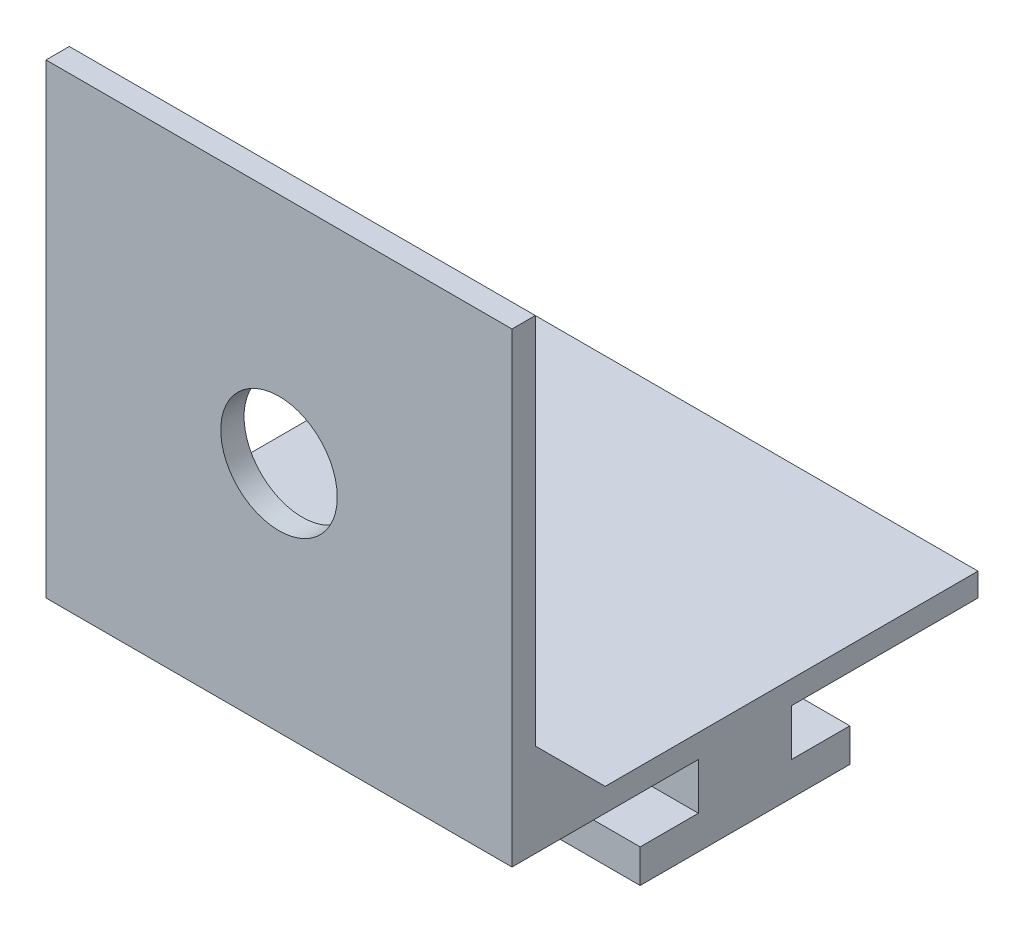
ISO-10303-21;
HEADER;
FILE_DESCRIPTION(('STEP AP214'),'2;1');
FILE_NAME('part.step','',(''),(''),'','','');
FILE_SCHEMA(('AUTOMOTIVE_DESIGN { 1 0 10303 214 1 1 1 1 }'));
ENDSEC;
DATA;
#1=APPLICATION_CONTEXT('core data for automotive mechanical design processes');
#2=APPLICATION_PROTOCOL_DEFINITION('international standard','automotive_design',2000,#1);
#3=PRODUCT_CONTEXT('',#1,'mechanical');
#4=PRODUCT('Part','Part','',(#3));
#5=PRODUCT_RELATED_PRODUCT_CATEGORY('part','',(#4));
#6=PRODUCT_DEFINITION_FORMATION('','',#4);
#7=PRODUCT_DEFINITION_CONTEXT('part definition',#1,'design');
#8=PRODUCT_DEFINITION('design','',#6,#7);
#9=PRODUCT_DEFINITION_SHAPE('','',#8);
#10=(LENGTH_UNIT() NAMED_UNIT(*) SI_UNIT(.MILLI.,.METRE.));
#11=(NAMED_UNIT(*) PLANE_ANGLE_UNIT() SI_UNIT($,.RADIAN.));
#12=(NAMED_UNIT(*) SI_UNIT($,.STERADIAN.) SOLID_ANGLE_UNIT());
#13=UNCERTAINTY_MEASURE_WITH_UNIT(LENGTH_MEASURE(1.E-05),#10,'distance_accuracy_value','');
#14=(GEOMETRIC_REPRESENTATION_CONTEXT(3) GLOBAL_UNCERTAINTY_ASSIGNED_CONTEXT((#13)) GLOBAL_UNIT_ASSIGNED_CONTEXT((#10,
#11,#12)) REPRESENTATION_CONTEXT('',''));
#15=CARTESIAN_POINT('',(0.,0.,0.));
#16=DIRECTION('',(0.,0.,1.));
#17=DIRECTION('',(1.,0.,0.));
#18=AXIS2_PLACEMENT_3D('',#15,#16,#17);
#19=CARTESIAN_POINT('',(0.,0.,0.));
#20=DIRECTION('',(0.,-1.,0.));
#21=DIRECTION('',(0.,0.,-1.));
#22=AXIS2_PLACEMENT_3D('',#19,#20,#21);
#23=PLANE('',#22);
#24=DIRECTION('',(0.,0.,1.));
#25=VECTOR('',#24,1.);
#26=CARTESIAN_POINT('',(-10.,0.,-10.));
#27=LINE('',#26,#25);
#28=CARTESIAN_POINT('',(-10.,0.,2.));
#29=VERTEX_POINT('',#28);
#30=CARTESIAN_POINT('',(-9.99999999999999,0.,10.));
#31=VERTEX_POINT('',#30);
#32=EDGE_CURVE('E219',#29,#31,#27,.T.);
#33=ORIENTED_EDGE('',*,*,#32,.F.);
#34=DIRECTION('',(1.,0.,0.));
#35=VECTOR('',#34,1.);
#36=CARTESIAN_POINT('',(-10.,0.,2.));
#37=LINE('',#36,#35);
#38=CARTESIAN_POINT('',(10.,0.,2.));
#39=VERTEX_POINT('',#38);
#40=EDGE_CURVE('E164',#29,#39,#37,.T.);
#41=ORIENTED_EDGE('',*,*,#40,.T.);
#42=DIRECTION('',(0.,0.,-1.));
#43=VECTOR('',#42,1.);
#44=CARTESIAN_POINT('',(10.,0.,-10.));
#45=LINE('',#44,#43);
#46=CARTESIAN_POINT('',(10.,0.,10.));
#47=VERTEX_POINT('',#46);
#48=EDGE_CURVE('E244',#47,#39,#45,.T.);
#49=ORIENTED_EDGE('',*,*,#48,.F.);
#50=DIRECTION('',(1.,0.,0.));
#51=VECTOR('',#50,1.);
#52=CARTESIAN_POINT('',(10.,0.,10.));
#53=LINE('',#52,#51);
#54=EDGE_CURVE('E233',#31,#47,#53,.T.);
#55=ORIENTED_EDGE('',*,*,#54,.F.);
#56=EDGE_LOOP('',(#33,#41,#49,#55));
#57=FACE_BOUND('',#56,.T.);
#58=ADVANCED_FACE('F33',(#57),#23,.T.);
#59=CARTESIAN_POINT('',(-10.,1.,-10.));
#60=DIRECTION('',(1.,0.,0.));
#61=DIRECTION('',(0.,0.,-1.));
#62=AXIS2_PLACEMENT_3D('',#59,#60,#61);
#63=PLANE('',#62);
#64=DIRECTION('',(0.,-1.,0.));
#65=VECTOR('',#64,1.);
#66=CARTESIAN_POINT('',(-9.99999999999999,0.,9.));
#67=LINE('',#66,#65);
#68=CARTESIAN_POINT('',(-9.99999999999999,20.,9.));
#69=VERTEX_POINT('',#68);
#70=CARTESIAN_POINT('',(-10.,4.,9.));
#71=VERTEX_POINT('',#70);
#72=EDGE_CURVE('E206',#69,#71,#67,.T.);
#73=ORIENTED_EDGE('',*,*,#72,.T.);
#74=DIRECTION('',(0.,0.707106781186547,0.707106781186548));
#75=VECTOR('',#74,1.);
#76=CARTESIAN_POINT('',(-10.,4.,9.));
#77=LINE('',#76,#75);
#78=CARTESIAN_POINT('',(-10.,1.,6.));
#79=VERTEX_POINT('',#78);
#80=EDGE_CURVE('E192',#79,#71,#77,.T.);
#81=ORIENTED_EDGE('',*,*,#80,.F.);
#82=DIRECTION('',(0.,0.,1.));
#83=VECTOR('',#82,1.);
#84=CARTESIAN_POINT('',(-10.,1.,-10.));
#85=LINE('',#84,#83);
#86=CARTESIAN_POINT('',(-10.,1.,-10.));
#87=VERTEX_POINT('',#86);
#88=EDGE_CURVE('E222',#87,#79,#85,.T.);
#89=ORIENTED_EDGE('',*,*,#88,.F.);
#90=DIRECTION('',(0.,-1.,0.));
#91=VECTOR('',#90,1.);
#92=CARTESIAN_POINT('',(-10.,1.,-10.));
#93=LINE('',#92,#91);
#94=CARTESIAN_POINT('',(-10.,0.,-10.));
#95=VERTEX_POINT('',#94);
#96=EDGE_CURVE('E230',#87,#95,#93,.T.);
#97=ORIENTED_EDGE('',*,*,#96,.T.);
#98=CARTESIAN_POINT('',(-10.,0.,-2.));
#99=VERTEX_POINT('',#98);
#100=EDGE_CURVE('E239',#95,#99,#27,.T.);
#101=ORIENTED_EDGE('',*,*,#100,.T.);
#102=DIRECTION('',(0.,1.,0.));
#103=VECTOR('',#102,1.);
#104=CARTESIAN_POINT('',(-10.,-2.,-2.));
#105=LINE('',#104,#103);
#106=CARTESIAN_POINT('',(-10.,-2.,-2.));
#107=VERTEX_POINT('',#106);
#108=EDGE_CURVE('E151',#107,#99,#105,.T.);
#109=ORIENTED_EDGE('',*,*,#108,.F.);
#110=DIRECTION('',(0.,0.,1.));
#111=VECTOR('',#110,1.);
#112=CARTESIAN_POINT('',(-10.,-2.,-4.5));
#113=LINE('',#112,#111);
#114=CARTESIAN_POINT('',(-10.,-2.,-4.5));
#115=VERTEX_POINT('',#114);
#116=EDGE_CURVE('E327',#115,#107,#113,.T.);
#117=ORIENTED_EDGE('',*,*,#116,.F.);
#118=DIRECTION('',(0.,1.,0.));
#119=VECTOR('',#118,1.);
#120=CARTESIAN_POINT('',(-10.,-3.43610218622617,-4.5));
#121=LINE('',#120,#119);
#122=CARTESIAN_POINT('',(-10.,-3.43610218622617,-4.5));
#123=VERTEX_POINT('',#122);
#124=EDGE_CURVE('E330',#123,#115,#121,.T.);
#125=ORIENTED_EDGE('',*,*,#124,.F.);
#126=DIRECTION('',(0.,0.,-1.));
#127=VECTOR('',#126,1.);
#128=CARTESIAN_POINT('',(-10.,-3.43610218622617,4.5));
#129=LINE('',#128,#127);
#130=CARTESIAN_POINT('',(-10.,-3.43610218622617,4.5));
#131=VERTEX_POINT('',#130);
#132=EDGE_CURVE('E332',#131,#123,#129,.T.);
#133=ORIENTED_EDGE('',*,*,#132,.F.);
#134=DIRECTION('',(0.,-1.,0.));
#135=VECTOR('',#134,1.);
#136=CARTESIAN_POINT('',(-10.,-2.,4.5));
#137=LINE('',#136,#135);
#138=CARTESIAN_POINT('',(-10.,-2.,4.5));
#139=VERTEX_POINT('',#138);
#140=EDGE_CURVE('E161',#139,#131,#137,.T.);
#141=ORIENTED_EDGE('',*,*,#140,.F.);
#142=DIRECTION('',(0.,0.,1.));
#143=VECTOR('',#142,1.);
#144=CARTESIAN_POINT('',(-10.,-2.,2.));
#145=LINE('',#144,#143);
#146=CARTESIAN_POINT('',(-10.,-2.,2.));
#147=VERTEX_POINT('',#146);
#148=EDGE_CURVE('E146',#147,#139,#145,.T.);
#149=ORIENTED_EDGE('',*,*,#148,.F.);
#150=DIRECTION('',(0.,-1.,0.));
#151=VECTOR('',#150,1.);
#152=CARTESIAN_POINT('',(-10.,0.,2.));
#153=LINE('',#152,#151);
#154=EDGE_CURVE('E157',#29,#147,#153,.T.);
#155=ORIENTED_EDGE('',*,*,#154,.F.);
#156=ORIENTED_EDGE('',*,*,#32,.T.);
#157=DIRECTION('',(0.,-1.,0.));
#158=VECTOR('',#157,1.);
#159=CARTESIAN_POINT('',(-9.99999999999999,1.,10.));
#160=LINE('',#159,#158);
#161=CARTESIAN_POINT('',(-9.99999999999999,20.,10.));
#162=VERTEX_POINT('',#161);
#163=EDGE_CURVE('E11',#162,#31,#160,.T.);
#164=ORIENTED_EDGE('',*,*,#163,.F.);
#165=DIRECTION('',(0.,0.,1.));
#166=VECTOR('',#165,1.);
#167=CARTESIAN_POINT('',(-9.99999999999999,20.,9.));
#168=LINE('',#167,#166);
#169=EDGE_CURVE('E216',#69,#162,#168,.T.);
#170=ORIENTED_EDGE('',*,*,#169,.F.);
#171=EDGE_LOOP('',(#73,#81,#89,#97,#101,#109,#117,#125,#133,#141,#149,#155,#156,#164,#170));
#172=FACE_BOUND('',#171,.T.);
#173=ADVANCED_FACE('F35',(#172),#63,.F.);
#174=CARTESIAN_POINT('',(10.,1.,10.));
#175=DIRECTION('',(0.,0.,-1.));
#176=DIRECTION('',(-1.,0.,0.));
#177=AXIS2_PLACEMENT_3D('',#174,#175,#176);
#178=PLANE('',#177);
#179=ORIENTED_EDGE('',*,*,#54,.T.);
#180=DIRECTION('',(0.,-1.,0.));
#181=VECTOR('',#180,1.);
#182=CARTESIAN_POINT('',(10.,1.,10.));
#183=LINE('',#182,#181);
#184=CARTESIAN_POINT('',(10.,20.,10.));
#185=VERTEX_POINT('',#184);
#186=EDGE_CURVE('E42',#185,#47,#183,.T.);
#187=ORIENTED_EDGE('',*,*,#186,.F.);
#188=DIRECTION('',(-1.,0.,0.));
#189=VECTOR('',#188,1.);
#190=CARTESIAN_POINT('',(-9.99999999999999,20.,10.));
#191=LINE('',#190,#189);
#192=EDGE_CURVE('E203',#185,#162,#191,.T.);
#193=ORIENTED_EDGE('',*,*,#192,.T.);
#194=ORIENTED_EDGE('',*,*,#163,.T.);
#195=EDGE_LOOP('',(#179,#187,#193,#194));
#196=FACE_BOUND('',#195,.T.);
#197=CARTESIAN_POINT('',(0.,10.,10.));
#198=DIRECTION('',(0.,0.,1.));
#199=DIRECTION('',(1.,0.,0.));
#200=AXIS2_PLACEMENT_3D('',#197,#198,#199);
#201=CIRCLE('',#200,2.5);
#202=CARTESIAN_POINT('',(2.5,10.,10.));
#203=VERTEX_POINT('',#202);
#204=EDGE_CURVE('E198',#203,#203,#201,.T.);
#205=ORIENTED_EDGE('',*,*,#204,.F.);
#206=EDGE_LOOP('',(#205));
#207=FACE_BOUND('',#206,.T.);
#208=ADVANCED_FACE('F269',(#196,#207),#178,.F.);
#209=CARTESIAN_POINT('',(10.,1.,-10.));
#210=DIRECTION('',(-1.,0.,0.));
#211=DIRECTION('',(0.,0.,1.));
#212=AXIS2_PLACEMENT_3D('',#209,#210,#211);
#213=PLANE('',#212);
#214=DIRECTION('',(0.,0.,-1.));
#215=VECTOR('',#214,1.);
#216=CARTESIAN_POINT('',(10.,1.,-10.));
#217=LINE('',#216,#215);
#218=CARTESIAN_POINT('',(10.,1.,6.));
#219=VERTEX_POINT('',#218);
#220=CARTESIAN_POINT('',(10.,1.,-10.));
#221=VERTEX_POINT('',#220);
#222=EDGE_CURVE('E225',#219,#221,#217,.T.);
#223=ORIENTED_EDGE('',*,*,#222,.F.);
#224=DIRECTION('',(0.,0.707106781186547,0.707106781186548));
#225=VECTOR('',#224,1.);
#226=CARTESIAN_POINT('',(10.,4.,9.));
#227=LINE('',#226,#225);
#228=CARTESIAN_POINT('',(10.,4.,9.));
#229=VERTEX_POINT('',#228);
#230=EDGE_CURVE('E195',#219,#229,#227,.T.);
#231=ORIENTED_EDGE('',*,*,#230,.T.);
#232=DIRECTION('',(0.,1.,0.));
#233=VECTOR('',#232,1.);
#234=CARTESIAN_POINT('',(10.,0.,9.));
#235=LINE('',#234,#233);
#236=CARTESIAN_POINT('',(10.,20.,9.));
#237=VERTEX_POINT('',#236);
#238=EDGE_CURVE('E208',#229,#237,#235,.T.);
#239=ORIENTED_EDGE('',*,*,#238,.T.);
#240=DIRECTION('',(0.,0.,1.));
#241=VECTOR('',#240,1.);
#242=CARTESIAN_POINT('',(10.,20.,9.));
#243=LINE('',#242,#241);
#244=EDGE_CURVE('E213',#237,#185,#243,.T.);
#245=ORIENTED_EDGE('',*,*,#244,.T.);
#246=ORIENTED_EDGE('',*,*,#186,.T.);
#247=ORIENTED_EDGE('',*,*,#48,.T.);
#248=DIRECTION('',(0.,-1.,0.));
#249=VECTOR('',#248,1.);
#250=CARTESIAN_POINT('',(10.,0.,2.));
#251=LINE('',#250,#249);
#252=CARTESIAN_POINT('',(10.,-2.,2.));
#253=VERTEX_POINT('',#252);
#254=EDGE_CURVE('E50',#39,#253,#251,.T.);
#255=ORIENTED_EDGE('',*,*,#254,.T.);
#256=DIRECTION('',(0.,0.,1.));
#257=VECTOR('',#256,1.);
#258=CARTESIAN_POINT('',(10.,-2.,2.));
#259=LINE('',#258,#257);
#260=CARTESIAN_POINT('',(10.,-2.,4.5));
#261=VERTEX_POINT('',#260);
#262=EDGE_CURVE('E148',#253,#261,#259,.T.);
#263=ORIENTED_EDGE('',*,*,#262,.T.);
#264=DIRECTION('',(0.,-1.,0.));
#265=VECTOR('',#264,1.);
#266=CARTESIAN_POINT('',(10.,-2.,4.5));
#267=LINE('',#266,#265);
#268=CARTESIAN_POINT('',(10.,-3.43610218622617,4.5));
#269=VERTEX_POINT('',#268);
#270=EDGE_CURVE('E337',#261,#269,#267,.T.);
#271=ORIENTED_EDGE('',*,*,#270,.T.);
#272=DIRECTION('',(0.,0.,-1.));
#273=VECTOR('',#272,1.);
#274=CARTESIAN_POINT('',(10.,-3.43610218622617,4.5));
#275=LINE('',#274,#273);
#276=CARTESIAN_POINT('',(10.,-3.43610218622617,-4.5));
#277=VERTEX_POINT('',#276);
#278=EDGE_CURVE('E340',#269,#277,#275,.T.);
#279=ORIENTED_EDGE('',*,*,#278,.T.);
#280=DIRECTION('',(0.,1.,0.));
#281=VECTOR('',#280,1.);
#282=CARTESIAN_POINT('',(10.,-3.43610218622617,-4.5));
#283=LINE('',#282,#281);
#284=CARTESIAN_POINT('',(10.,-2.,-4.5));
#285=VERTEX_POINT('',#284);
#286=EDGE_CURVE('E343',#277,#285,#283,.T.);
#287=ORIENTED_EDGE('',*,*,#286,.T.);
#288=DIRECTION('',(0.,0.,1.));
#289=VECTOR('',#288,1.);
#290=CARTESIAN_POINT('',(10.,-2.,-4.5));
#291=LINE('',#290,#289);
#292=CARTESIAN_POINT('',(10.,-2.,-2.));
#293=VERTEX_POINT('',#292);
#294=EDGE_CURVE('E168',#285,#293,#291,.T.);
#295=ORIENTED_EDGE('',*,*,#294,.T.);
#296=DIRECTION('',(0.,1.,0.));
#297=VECTOR('',#296,1.);
#298=CARTESIAN_POINT('',(10.,-2.,-2.));
#299=LINE('',#298,#297);
#300=CARTESIAN_POINT('',(10.,0.,-2.));
#301=VERTEX_POINT('',#300);
#302=EDGE_CURVE('E165',#293,#301,#299,.T.);
#303=ORIENTED_EDGE('',*,*,#302,.T.);
#304=CARTESIAN_POINT('',(10.,0.,-10.));
#305=VERTEX_POINT('',#304);
#306=EDGE_CURVE('E242',#301,#305,#45,.T.);
#307=ORIENTED_EDGE('',*,*,#306,.T.);
#308=DIRECTION('',(0.,-1.,0.));
#309=VECTOR('',#308,1.);
#310=CARTESIAN_POINT('',(10.,1.,-10.));
#311=LINE('',#310,#309);
#312=EDGE_CURVE('E251',#221,#305,#311,.T.);
#313=ORIENTED_EDGE('',*,*,#312,.F.);
#314=EDGE_LOOP('',(#223,#231,#239,#245,#246,#247,#255,#263,#271,#279,#287,#295,#303,#307,#313));
#315=FACE_BOUND('',#314,.T.);
#316=ADVANCED_FACE('F259',(#315),#213,.F.);
#317=CARTESIAN_POINT('',(10.,1.,-10.));
#318=DIRECTION('',(0.,0.,1.));
#319=DIRECTION('',(1.,0.,0.));
#320=AXIS2_PLACEMENT_3D('',#317,#318,#319);
#321=PLANE('',#320);
#322=DIRECTION('',(-1.,0.,0.));
#323=VECTOR('',#322,1.);
#324=CARTESIAN_POINT('',(10.,0.,-10.));
#325=LINE('',#324,#323);
#326=EDGE_CURVE('E226',#305,#95,#325,.T.);
#327=ORIENTED_EDGE('',*,*,#326,.T.);
#328=ORIENTED_EDGE('',*,*,#96,.F.);
#329=DIRECTION('',(-1.,0.,0.));
#330=VECTOR('',#329,1.);
#331=CARTESIAN_POINT('',(10.,1.,-10.));
#332=LINE('',#331,#330);
#333=EDGE_CURVE('E228',#221,#87,#332,.T.);
#334=ORIENTED_EDGE('',*,*,#333,.F.);
#335=ORIENTED_EDGE('',*,*,#312,.T.);
#336=EDGE_LOOP('',(#327,#328,#334,#335));
#337=FACE_BOUND('',#336,.T.);
#338=ADVANCED_FACE('F304',(#337),#321,.F.);
#339=CARTESIAN_POINT('',(0.,1.,0.));
#340=DIRECTION('',(0.,-1.,0.));
#341=DIRECTION('',(0.,0.,-1.));
#342=AXIS2_PLACEMENT_3D('',#339,#340,#341);
#343=PLANE('',#342);
#344=ORIENTED_EDGE('',*,*,#88,.T.);
#345=DIRECTION('',(1.,0.,0.));
#346=VECTOR('',#345,1.);
#347=CARTESIAN_POINT('',(-10.,1.,6.));
#348=LINE('',#347,#346);
#349=EDGE_CURVE('E194',#79,#219,#348,.T.);
#350=ORIENTED_EDGE('',*,*,#349,.T.);
#351=ORIENTED_EDGE('',*,*,#222,.T.);
#352=ORIENTED_EDGE('',*,*,#333,.T.);
#353=EDGE_LOOP('',(#344,#350,#351,#352));
#354=FACE_BOUND('',#353,.T.);
#355=ADVANCED_FACE('F297',(#354),#343,.F.);
#356=DIRECTION('',(1.,0.,0.));
#357=VECTOR('',#356,1.);
#358=CARTESIAN_POINT('',(-10.,0.,-2.));
#359=LINE('',#358,#357);
#360=EDGE_CURVE('E175',#99,#301,#359,.T.);
#361=ORIENTED_EDGE('',*,*,#360,.F.);
#362=ORIENTED_EDGE('',*,*,#100,.F.);
#363=ORIENTED_EDGE('',*,*,#326,.F.);
#364=ORIENTED_EDGE('',*,*,#306,.F.);
#365=EDGE_LOOP('',(#361,#362,#363,#364));
#366=FACE_BOUND('',#365,.T.);
#367=ADVANCED_FACE('F290',(#366),#23,.T.);
#368=CARTESIAN_POINT('',(0.,0.,9.));
#369=DIRECTION('',(0.,0.,-1.));
#370=DIRECTION('',(-1.,0.,0.));
#371=AXIS2_PLACEMENT_3D('',#368,#369,#370);
#372=PLANE('',#371);
#373=DIRECTION('',(1.,0.,0.));
#374=VECTOR('',#373,1.);
#375=CARTESIAN_POINT('',(-10.,4.,9.));
#376=LINE('',#375,#374);
#377=EDGE_CURVE('E58',#71,#229,#376,.T.);
#378=ORIENTED_EDGE('',*,*,#377,.F.);
#379=ORIENTED_EDGE('',*,*,#72,.F.);
#380=DIRECTION('',(-1.,0.,0.));
#381=VECTOR('',#380,1.);
#382=CARTESIAN_POINT('',(-9.99999999999999,20.,9.));
#383=LINE('',#382,#381);
#384=EDGE_CURVE('E210',#237,#69,#383,.T.);
#385=ORIENTED_EDGE('',*,*,#384,.F.);
#386=ORIENTED_EDGE('',*,*,#238,.F.);
#387=EDGE_LOOP('',(#378,#379,#385,#386));
#388=FACE_BOUND('',#387,.T.);
#389=CARTESIAN_POINT('',(0.,10.,9.));
#390=DIRECTION('',(0.,0.,1.));
#391=DIRECTION('',(1.,0.,0.));
#392=AXIS2_PLACEMENT_3D('',#389,#390,#391);
#393=CIRCLE('',#392,2.5);
#394=CARTESIAN_POINT('',(2.5,10.,9.));
#395=VERTEX_POINT('',#394);
#396=EDGE_CURVE('E200',#395,#395,#393,.T.);
#397=ORIENTED_EDGE('',*,*,#396,.T.);
#398=EDGE_LOOP('',(#397));
#399=FACE_BOUND('',#398,.T.);
#400=ADVANCED_FACE('F284',(#388,#399),#372,.T.);
#401=CARTESIAN_POINT('',(-9.99999999999999,20.,9.));
#402=DIRECTION('',(0.,1.,0.));
#403=DIRECTION('',(0.,0.,1.));
#404=AXIS2_PLACEMENT_3D('',#401,#402,#403);
#405=PLANE('',#404);
#406=ORIENTED_EDGE('',*,*,#192,.F.);
#407=ORIENTED_EDGE('',*,*,#244,.F.);
#408=ORIENTED_EDGE('',*,*,#384,.T.);
#409=ORIENTED_EDGE('',*,*,#169,.T.);
#410=EDGE_LOOP('',(#406,#407,#408,#409));
#411=FACE_BOUND('',#410,.T.);
#412=ADVANCED_FACE('F267',(#411),#405,.T.);
#413=CARTESIAN_POINT('',(0.,10.,9.));
#414=DIRECTION('',(0.,0.,1.));
#415=DIRECTION('',(1.,0.,0.));
#416=AXIS2_PLACEMENT_3D('',#413,#414,#415);
#417=CYLINDRICAL_SURFACE('',#416,2.5);
#418=ORIENTED_EDGE('',*,*,#396,.F.);
#419=EDGE_LOOP('',(#418));
#420=FACE_BOUND('',#419,.T.);
#421=ORIENTED_EDGE('',*,*,#204,.T.);
#422=EDGE_LOOP('',(#421));
#423=FACE_BOUND('',#422,.T.);
#424=ADVANCED_FACE('F274',(#420,#423),#417,.F.);
#425=CARTESIAN_POINT('',(-10.,4.,9.));
#426=DIRECTION('',(0.,0.707106781186548,-0.707106781186547));
#427=DIRECTION('',(0.,0.707106781186547,0.707106781186548));
#428=AXIS2_PLACEMENT_3D('',#425,#426,#427);
#429=PLANE('',#428);
#430=ORIENTED_EDGE('',*,*,#230,.F.);
#431=ORIENTED_EDGE('',*,*,#349,.F.);
#432=ORIENTED_EDGE('',*,*,#80,.T.);
#433=ORIENTED_EDGE('',*,*,#377,.T.);
#434=EDGE_LOOP('',(#430,#431,#432,#433));
#435=FACE_BOUND('',#434,.T.);
#436=ADVANCED_FACE('F276',(#435),#429,.T.);
#437=CARTESIAN_POINT('',(-10.,0.,2.));
#438=DIRECTION('',(0.,0.,1.));
#439=DIRECTION('',(0.,-1.,0.));
#440=AXIS2_PLACEMENT_3D('',#437,#438,#439);
#441=PLANE('',#440);
#442=ORIENTED_EDGE('',*,*,#254,.F.);
#443=ORIENTED_EDGE('',*,*,#40,.F.);
#444=ORIENTED_EDGE('',*,*,#154,.T.);
#445=DIRECTION('',(1.,0.,0.));
#446=VECTOR('',#445,1.);
#447=CARTESIAN_POINT('',(-10.,-2.,2.));
#448=LINE('',#447,#446);
#449=EDGE_CURVE('E143',#147,#253,#448,.T.);
#450=ORIENTED_EDGE('',*,*,#449,.T.);
#451=EDGE_LOOP('',(#442,#443,#444,#450));
#452=FACE_BOUND('',#451,.T.);
#453=ADVANCED_FACE('F163',(#452),#441,.T.);
#454=CARTESIAN_POINT('',(-10.,-2.,-2.));
#455=DIRECTION('',(0.,0.,-1.));
#456=DIRECTION('',(-1.,0.,0.));
#457=AXIS2_PLACEMENT_3D('',#454,#455,#456);
#458=PLANE('',#457);
#459=ORIENTED_EDGE('',*,*,#302,.F.);
#460=DIRECTION('',(1.,0.,0.));
#461=VECTOR('',#460,1.);
#462=CARTESIAN_POINT('',(-10.,-2.,-2.));
#463=LINE('',#462,#461);
#464=EDGE_CURVE('E178',#107,#293,#463,.T.);
#465=ORIENTED_EDGE('',*,*,#464,.F.);
#466=ORIENTED_EDGE('',*,*,#108,.T.);
#467=ORIENTED_EDGE('',*,*,#360,.T.);
#468=EDGE_LOOP('',(#459,#465,#466,#467));
#469=FACE_BOUND('',#468,.T.);
#470=ADVANCED_FACE('F324',(#469),#458,.T.);
#471=CARTESIAN_POINT('',(-10.,-2.,-4.5));
#472=DIRECTION('',(0.,1.,0.));
#473=DIRECTION('',(0.,0.,1.));
#474=AXIS2_PLACEMENT_3D('',#471,#472,#473);
#475=PLANE('',#474);
#476=ORIENTED_EDGE('',*,*,#294,.F.);
#477=DIRECTION('',(1.,0.,0.));
#478=VECTOR('',#477,1.);
#479=CARTESIAN_POINT('',(-10.,-2.,-4.5));
#480=LINE('',#479,#478);
#481=EDGE_CURVE('E185',#115,#285,#480,.T.);
#482=ORIENTED_EDGE('',*,*,#481,.F.);
#483=ORIENTED_EDGE('',*,*,#116,.T.);
#484=ORIENTED_EDGE('',*,*,#464,.T.);
#485=EDGE_LOOP('',(#476,#482,#483,#484));
#486=FACE_BOUND('',#485,.T.);
#487=ADVANCED_FACE('F326',(#486),#475,.T.);
#488=CARTESIAN_POINT('',(-10.,-3.43610218622617,-4.5));
#489=DIRECTION('',(0.,0.,-1.));
#490=DIRECTION('',(-1.,0.,0.));
#491=AXIS2_PLACEMENT_3D('',#488,#489,#490);
#492=PLANE('',#491);
#493=ORIENTED_EDGE('',*,*,#286,.F.);
#494=DIRECTION('',(1.,0.,0.));
#495=VECTOR('',#494,1.);
#496=CARTESIAN_POINT('',(-10.,-3.43610218622617,-4.5));
#497=LINE('',#496,#495);
#498=EDGE_CURVE('E187',#123,#277,#497,.T.);
#499=ORIENTED_EDGE('',*,*,#498,.F.);
#500=ORIENTED_EDGE('',*,*,#124,.T.);
#501=ORIENTED_EDGE('',*,*,#481,.T.);
#502=EDGE_LOOP('',(#493,#499,#500,#501));
#503=FACE_BOUND('',#502,.T.);
#504=ADVANCED_FACE('F347',(#503),#492,.T.);
#505=CARTESIAN_POINT('',(-10.,-3.43610218622617,4.5));
#506=DIRECTION('',(0.,-1.,0.));
#507=DIRECTION('',(0.,0.,-1.));
#508=AXIS2_PLACEMENT_3D('',#505,#506,#507);
#509=PLANE('',#508);
#510=ORIENTED_EDGE('',*,*,#278,.F.);
#511=DIRECTION('',(1.,0.,0.));
#512=VECTOR('',#511,1.);
#513=CARTESIAN_POINT('',(-10.,-3.43610218622617,4.5));
#514=LINE('',#513,#512);
#515=EDGE_CURVE('E189',#131,#269,#514,.T.);
#516=ORIENTED_EDGE('',*,*,#515,.F.);
#517=ORIENTED_EDGE('',*,*,#132,.T.);
#518=ORIENTED_EDGE('',*,*,#498,.T.);
#519=EDGE_LOOP('',(#510,#516,#517,#518));
#520=FACE_BOUND('',#519,.T.);
#521=ADVANCED_FACE('F350',(#520),#509,.T.);
#522=CARTESIAN_POINT('',(-10.,-2.,4.5));
#523=DIRECTION('',(0.,0.,1.));
#524=DIRECTION('',(1.,0.,0.));
#525=AXIS2_PLACEMENT_3D('',#522,#523,#524);
#526=PLANE('',#525);
#527=ORIENTED_EDGE('',*,*,#270,.F.);
#528=DIRECTION('',(1.,0.,0.));
#529=VECTOR('',#528,1.);
#530=CARTESIAN_POINT('',(-10.,-2.,4.5));
#531=LINE('',#530,#529);
#532=EDGE_CURVE('E150',#139,#261,#531,.T.);
#533=ORIENTED_EDGE('',*,*,#532,.F.);
#534=ORIENTED_EDGE('',*,*,#140,.T.);
#535=ORIENTED_EDGE('',*,*,#515,.T.);
#536=EDGE_LOOP('',(#527,#533,#534,#535));
#537=FACE_BOUND('',#536,.T.);
#538=ADVANCED_FACE('F354',(#537),#526,.T.);
#539=CARTESIAN_POINT('',(-10.,-2.,2.));
#540=DIRECTION('',(0.,1.,0.));
#541=DIRECTION('',(0.,0.,1.));
#542=AXIS2_PLACEMENT_3D('',#539,#540,#541);
#543=PLANE('',#542);
#544=ORIENTED_EDGE('',*,*,#262,.F.);
#545=ORIENTED_EDGE('',*,*,#449,.F.);
#546=ORIENTED_EDGE('',*,*,#148,.T.);
#547=ORIENTED_EDGE('',*,*,#532,.T.);
#548=EDGE_LOOP('',(#544,#545,#546,#547));
#549=FACE_BOUND('',#548,.T.);
#550=ADVANCED_FACE('F145',(#549),#543,.T.);
#551=CLOSED_SHELL('',(#58,#173,#208,#316,#338,#355,#367,#400,#412,#424,#436,#453,#470,#487,#504,
#521,#538,#550));
#552=MANIFOLD_SOLID_BREP('B2',#551);
#553=ADVANCED_BREP_SHAPE_REPRESENTATION('',(#18,#552),#14);
#554=SHAPE_DEFINITION_REPRESENTATION(#9,#553);
ENDSEC;
END-ISO-10303-21;
